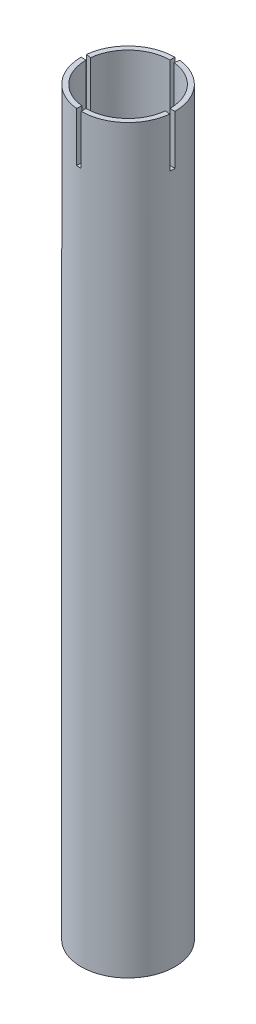
ISO-10303-21;
HEADER;
FILE_DESCRIPTION(('STEP AP214'),'2;1');
FILE_NAME('part.step','',(''),(''),'','','');
FILE_SCHEMA(('AUTOMOTIVE_DESIGN { 1 0 10303 214 1 1 1 1 }'));
ENDSEC;
DATA;
#1=APPLICATION_CONTEXT('core data for automotive mechanical design processes');
#2=APPLICATION_PROTOCOL_DEFINITION('international standard','automotive_design',2000,#1);
#3=PRODUCT_CONTEXT('',#1,'mechanical');
#4=PRODUCT('Part','Part','',(#3));
#5=PRODUCT_RELATED_PRODUCT_CATEGORY('part','',(#4));
#6=PRODUCT_DEFINITION_FORMATION('','',#4);
#7=PRODUCT_DEFINITION_CONTEXT('part definition',#1,'design');
#8=PRODUCT_DEFINITION('design','',#6,#7);
#9=PRODUCT_DEFINITION_SHAPE('','',#8);
#10=(LENGTH_UNIT() NAMED_UNIT(*) SI_UNIT(.MILLI.,.METRE.));
#11=(NAMED_UNIT(*) PLANE_ANGLE_UNIT() SI_UNIT($,.RADIAN.));
#12=(NAMED_UNIT(*) SI_UNIT($,.STERADIAN.) SOLID_ANGLE_UNIT());
#13=UNCERTAINTY_MEASURE_WITH_UNIT(LENGTH_MEASURE(1.E-05),#10,'distance_accuracy_value','');
#14=(GEOMETRIC_REPRESENTATION_CONTEXT(3) GLOBAL_UNCERTAINTY_ASSIGNED_CONTEXT((#13)) GLOBAL_UNIT_ASSIGNED_CONTEXT((#10,
#11,#12)) REPRESENTATION_CONTEXT('',''));
#15=CARTESIAN_POINT('',(0.,0.,0.));
#16=DIRECTION('',(0.,0.,1.));
#17=DIRECTION('',(1.,0.,0.));
#18=AXIS2_PLACEMENT_3D('',#15,#16,#17);
#19=CARTESIAN_POINT('',(0.,300.,0.));
#20=DIRECTION('',(0.,1.,0.));
#21=DIRECTION('',(0.,0.,1.));
#22=AXIS2_PLACEMENT_3D('',#19,#20,#21);
#23=PLANE('',#22);
#24=DIRECTION('',(0.994505452921407,0.,0.104684784518032));
#25=VECTOR('',#24,1.);
#26=CARTESIAN_POINT('',(19.,300.,1.9999999999998));
#27=LINE('',#26,#25);
#28=CARTESIAN_POINT('',(16.9065926996639,300.,1.77964133680655));
#29=VERTEX_POINT('',#28);
#30=CARTESIAN_POINT('',(18.8956036055067,300.,1.98901090584261));
#31=VERTEX_POINT('',#30);
#32=EDGE_CURVE('E282',#29,#31,#27,.T.);
#33=ORIENTED_EDGE('',*,*,#32,.F.);
#34=CARTESIAN_POINT('',(0.,300.,0.));
#35=DIRECTION('',(0.,1.,0.));
#36=DIRECTION('',(0.,0.,1.));
#37=AXIS2_PLACEMENT_3D('',#34,#35,#36);
#38=CIRCLE('',#37,17.);
#39=CARTESIAN_POINT('',(0.,300.,17.));
#40=VERTEX_POINT('',#39);
#41=EDGE_CURVE('E309',#40,#29,#38,.T.);
#42=ORIENTED_EDGE('',*,*,#41,.F.);
#43=DIRECTION('',(0.,0.,-1.));
#44=VECTOR('',#43,1.);
#45=CARTESIAN_POINT('',(0.,300.,0.));
#46=LINE('',#45,#44);
#47=CARTESIAN_POINT('',(0.,300.,19.));
#48=VERTEX_POINT('',#47);
#49=EDGE_CURVE('E189',#48,#40,#46,.T.);
#50=ORIENTED_EDGE('',*,*,#49,.F.);
#51=CARTESIAN_POINT('',(0.,300.,0.));
#52=DIRECTION('',(0.,1.,0.));
#53=DIRECTION('',(1.,0.,0.));
#54=AXIS2_PLACEMENT_3D('',#51,#52,#53);
#55=CIRCLE('',#54,19.);
#56=EDGE_CURVE('E288',#48,#31,#55,.T.);
#57=ORIENTED_EDGE('',*,*,#56,.T.);
#58=EDGE_LOOP('',(#33,#42,#50,#57));
#59=FACE_BOUND('',#58,.T.);
#60=ADVANCED_FACE('F48',(#59),#23,.T.);
#61=DIRECTION('',(-0.104684784518043,0.,0.994505452921406));
#62=VECTOR('',#61,1.);
#63=CARTESIAN_POINT('',(-2.,300.,19.));
#64=LINE('',#63,#62);
#65=CARTESIAN_POINT('',(-1.77964133680673,300.,16.9065926996639));
#66=VERTEX_POINT('',#65);
#67=CARTESIAN_POINT('',(-1.98901090584281,300.,18.8956036055067));
#68=VERTEX_POINT('',#67);
#69=EDGE_CURVE('E185',#66,#68,#64,.T.);
#70=ORIENTED_EDGE('',*,*,#69,.F.);
#71=CARTESIAN_POINT('',(-17.,300.,0.));
#72=VERTEX_POINT('',#71);
#73=EDGE_CURVE('E237',#72,#66,#38,.T.);
#74=ORIENTED_EDGE('',*,*,#73,.F.);
#75=DIRECTION('',(1.,0.,0.));
#76=VECTOR('',#75,1.);
#77=CARTESIAN_POINT('',(0.,300.,0.));
#78=LINE('',#77,#76);
#79=CARTESIAN_POINT('',(-19.,300.,0.));
#80=VERTEX_POINT('',#79);
#81=EDGE_CURVE('E205',#80,#72,#78,.T.);
#82=ORIENTED_EDGE('',*,*,#81,.F.);
#83=EDGE_CURVE('E245',#80,#68,#55,.T.);
#84=ORIENTED_EDGE('',*,*,#83,.T.);
#85=EDGE_LOOP('',(#70,#74,#82,#84));
#86=FACE_BOUND('',#85,.T.);
#87=ADVANCED_FACE('F318',(#86),#23,.T.);
#88=DIRECTION('',(-0.994505452921406,0.,-0.104684784518039));
#89=VECTOR('',#88,1.);
#90=CARTESIAN_POINT('',(-19.,300.,-1.99999999999993));
#91=LINE('',#90,#89);
#92=CARTESIAN_POINT('',(-16.9065926996639,300.,-1.77964133680667));
#93=VERTEX_POINT('',#92);
#94=CARTESIAN_POINT('',(-18.8956036055067,300.,-1.98901090584275));
#95=VERTEX_POINT('',#94);
#96=EDGE_CURVE('E200',#93,#95,#91,.T.);
#97=ORIENTED_EDGE('',*,*,#96,.F.);
#98=CARTESIAN_POINT('',(0.,300.,-17.));
#99=VERTEX_POINT('',#98);
#100=EDGE_CURVE('E233',#99,#93,#38,.T.);
#101=ORIENTED_EDGE('',*,*,#100,.F.);
#102=DIRECTION('',(0.,0.,1.));
#103=VECTOR('',#102,1.);
#104=CARTESIAN_POINT('',(0.,300.,0.));
#105=LINE('',#104,#103);
#106=CARTESIAN_POINT('',(0.,300.,-19.));
#107=VERTEX_POINT('',#106);
#108=EDGE_CURVE('E221',#107,#99,#105,.T.);
#109=ORIENTED_EDGE('',*,*,#108,.F.);
#110=EDGE_CURVE('E241',#107,#95,#55,.T.);
#111=ORIENTED_EDGE('',*,*,#110,.T.);
#112=EDGE_LOOP('',(#97,#101,#109,#111));
#113=FACE_BOUND('',#112,.T.);
#114=ADVANCED_FACE('F342',(#113),#23,.T.);
#115=DIRECTION('',(-1.,0.,0.));
#116=VECTOR('',#115,1.);
#117=CARTESIAN_POINT('',(0.,300.,0.));
#118=LINE('',#117,#116);
#119=CARTESIAN_POINT('',(19.,300.,-1.99014436314059E-13));
#120=VERTEX_POINT('',#119);
#121=CARTESIAN_POINT('',(17.,300.,-1.78065548281E-13));
#122=VERTEX_POINT('',#121);
#123=EDGE_CURVE('E181',#120,#122,#118,.T.);
#124=ORIENTED_EDGE('',*,*,#123,.F.);
#125=CARTESIAN_POINT('',(1.98901090584281,300.,-18.8956036055067));
#126=VERTEX_POINT('',#125);
#127=EDGE_CURVE('E178',#120,#126,#55,.T.);
#128=ORIENTED_EDGE('',*,*,#127,.T.);
#129=DIRECTION('',(0.104684784518043,0.,-0.994505452921406));
#130=VECTOR('',#129,1.);
#131=CARTESIAN_POINT('',(2.,300.,-19.));
#132=LINE('',#131,#130);
#133=CARTESIAN_POINT('',(1.77964133680673,300.,-16.9065926996639));
#134=VERTEX_POINT('',#133);
#135=EDGE_CURVE('E216',#134,#126,#132,.T.);
#136=ORIENTED_EDGE('',*,*,#135,.F.);
#137=EDGE_CURVE('E238',#122,#134,#38,.T.);
#138=ORIENTED_EDGE('',*,*,#137,.F.);
#139=EDGE_LOOP('',(#124,#128,#136,#138));
#140=FACE_BOUND('',#139,.T.);
#141=ADVANCED_FACE('F293',(#140),#23,.T.);
#142=CARTESIAN_POINT('',(0.,0.,0.));
#143=DIRECTION('',(0.,1.,0.));
#144=DIRECTION('',(0.,0.,1.));
#145=AXIS2_PLACEMENT_3D('',#142,#143,#144);
#146=PLANE('',#145);
#147=CARTESIAN_POINT('',(0.,0.,0.));
#148=DIRECTION('',(0.,1.,0.));
#149=DIRECTION('',(1.,0.,0.));
#150=AXIS2_PLACEMENT_3D('',#147,#148,#149);
#151=CIRCLE('',#150,19.);
#152=CARTESIAN_POINT('',(19.,0.,0.));
#153=VERTEX_POINT('',#152);
#154=EDGE_CURVE('E236',#153,#153,#151,.T.);
#155=ORIENTED_EDGE('',*,*,#154,.F.);
#156=EDGE_LOOP('',(#155));
#157=FACE_BOUND('',#156,.T.);
#158=CARTESIAN_POINT('',(0.,0.,0.));
#159=DIRECTION('',(0.,1.,0.));
#160=DIRECTION('',(0.,0.,1.));
#161=AXIS2_PLACEMENT_3D('',#158,#159,#160);
#162=CIRCLE('',#161,17.);
#163=CARTESIAN_POINT('',(0.,0.,17.));
#164=VERTEX_POINT('',#163);
#165=EDGE_CURVE('E232',#164,#164,#162,.T.);
#166=ORIENTED_EDGE('',*,*,#165,.T.);
#167=EDGE_LOOP('',(#166));
#168=FACE_BOUND('',#167,.T.);
#169=ADVANCED_FACE('F345',(#157,#168),#146,.F.);
#170=CARTESIAN_POINT('',(0.,300.,0.));
#171=DIRECTION('',(0.,-1.,0.));
#172=DIRECTION('',(0.,0.,-1.));
#173=AXIS2_PLACEMENT_3D('',#170,#171,#172);
#174=CYLINDRICAL_SURFACE('',#173,19.);
#175=CARTESIAN_POINT('',(0.,280.,0.));
#176=DIRECTION('',(0.,1.,0.));
#177=DIRECTION('',(0.,0.,1.));
#178=AXIS2_PLACEMENT_3D('',#175,#176,#177);
#179=CIRCLE('',#178,19.);
#180=CARTESIAN_POINT('',(18.8956036055067,280.,1.98901090584261));
#181=VERTEX_POINT('',#180);
#182=CARTESIAN_POINT('',(19.,280.,-1.99014436314059E-13));
#183=VERTEX_POINT('',#182);
#184=EDGE_CURVE('E159',#181,#183,#179,.T.);
#185=ORIENTED_EDGE('',*,*,#184,.F.);
#186=DIRECTION('',(0.,-1.,0.));
#187=VECTOR('',#186,1.);
#188=CARTESIAN_POINT('',(18.8956036055067,300.,1.98901090584261));
#189=LINE('',#188,#187);
#190=EDGE_CURVE('E166',#181,#31,#189,.F.);
#191=ORIENTED_EDGE('',*,*,#190,.T.);
#192=ORIENTED_EDGE('',*,*,#56,.F.);
#193=DIRECTION('',(0.,1.,0.));
#194=VECTOR('',#193,1.);
#195=CARTESIAN_POINT('',(0.,280.,19.));
#196=LINE('',#195,#194);
#197=CARTESIAN_POINT('',(0.,280.,19.));
#198=VERTEX_POINT('',#197);
#199=EDGE_CURVE('E191',#198,#48,#196,.T.);
#200=ORIENTED_EDGE('',*,*,#199,.F.);
#201=CARTESIAN_POINT('',(0.,280.,0.));
#202=DIRECTION('',(0.,1.,0.));
#203=DIRECTION('',(0.,0.,1.));
#204=AXIS2_PLACEMENT_3D('',#201,#202,#203);
#205=CIRCLE('',#204,19.);
#206=CARTESIAN_POINT('',(-1.98901090584281,280.,18.8956036055067));
#207=VERTEX_POINT('',#206);
#208=EDGE_CURVE('E195',#207,#198,#205,.T.);
#209=ORIENTED_EDGE('',*,*,#208,.F.);
#210=DIRECTION('',(0.,-1.,0.));
#211=VECTOR('',#210,1.);
#212=CARTESIAN_POINT('',(-1.98901090584281,300.,18.8956036055067));
#213=LINE('',#212,#211);
#214=EDGE_CURVE('E197',#207,#68,#213,.F.);
#215=ORIENTED_EDGE('',*,*,#214,.T.);
#216=ORIENTED_EDGE('',*,*,#83,.F.);
#217=DIRECTION('',(0.,1.,0.));
#218=VECTOR('',#217,1.);
#219=CARTESIAN_POINT('',(-19.,280.,0.));
#220=LINE('',#219,#218);
#221=CARTESIAN_POINT('',(-19.,280.,0.));
#222=VERTEX_POINT('',#221);
#223=EDGE_CURVE('E207',#222,#80,#220,.T.);
#224=ORIENTED_EDGE('',*,*,#223,.F.);
#225=CARTESIAN_POINT('',(0.,280.,0.));
#226=DIRECTION('',(0.,1.,0.));
#227=DIRECTION('',(0.,0.,1.));
#228=AXIS2_PLACEMENT_3D('',#225,#226,#227);
#229=CIRCLE('',#228,19.);
#230=CARTESIAN_POINT('',(-18.8956036055067,280.,-1.98901090584275));
#231=VERTEX_POINT('',#230);
#232=EDGE_CURVE('E211',#231,#222,#229,.T.);
#233=ORIENTED_EDGE('',*,*,#232,.F.);
#234=DIRECTION('',(0.,-1.,0.));
#235=VECTOR('',#234,1.);
#236=CARTESIAN_POINT('',(-18.8956036055067,300.,-1.98901090584275));
#237=LINE('',#236,#235);
#238=EDGE_CURVE('E213',#231,#95,#237,.F.);
#239=ORIENTED_EDGE('',*,*,#238,.T.);
#240=ORIENTED_EDGE('',*,*,#110,.F.);
#241=DIRECTION('',(0.,1.,0.));
#242=VECTOR('',#241,1.);
#243=CARTESIAN_POINT('',(0.,280.,-19.));
#244=LINE('',#243,#242);
#245=CARTESIAN_POINT('',(0.,280.,-19.));
#246=VERTEX_POINT('',#245);
#247=EDGE_CURVE('E223',#246,#107,#244,.T.);
#248=ORIENTED_EDGE('',*,*,#247,.F.);
#249=CARTESIAN_POINT('',(0.,280.,0.));
#250=DIRECTION('',(0.,1.,0.));
#251=DIRECTION('',(0.,0.,1.));
#252=AXIS2_PLACEMENT_3D('',#249,#250,#251);
#253=CIRCLE('',#252,19.);
#254=CARTESIAN_POINT('',(1.98901090584281,280.,-18.8956036055067));
#255=VERTEX_POINT('',#254);
#256=EDGE_CURVE('E228',#255,#246,#253,.T.);
#257=ORIENTED_EDGE('',*,*,#256,.F.);
#258=DIRECTION('',(0.,-1.,0.));
#259=VECTOR('',#258,1.);
#260=CARTESIAN_POINT('',(1.98901090584281,300.,-18.8956036055067));
#261=LINE('',#260,#259);
#262=EDGE_CURVE('E230',#255,#126,#261,.F.);
#263=ORIENTED_EDGE('',*,*,#262,.T.);
#264=ORIENTED_EDGE('',*,*,#127,.F.);
#265=DIRECTION('',(0.,1.,0.));
#266=VECTOR('',#265,1.);
#267=CARTESIAN_POINT('',(19.,280.,-1.99014436314059E-13));
#268=LINE('',#267,#266);
#269=EDGE_CURVE('E167',#183,#120,#268,.T.);
#270=ORIENTED_EDGE('',*,*,#269,.F.);
#271=EDGE_LOOP('',(#185,#191,#192,#200,#209,#215,#216,#224,#233,#239,#240,#248,#257,#263,#264,#270));
#272=FACE_BOUND('',#271,.T.);
#273=ORIENTED_EDGE('',*,*,#154,.T.);
#274=EDGE_LOOP('',(#273));
#275=FACE_BOUND('',#274,.T.);
#276=ADVANCED_FACE('F50',(#272,#275),#174,.T.);
#277=CARTESIAN_POINT('',(0.,300.,0.));
#278=DIRECTION('',(0.,-1.,0.));
#279=DIRECTION('',(0.,0.,-1.));
#280=AXIS2_PLACEMENT_3D('',#277,#278,#279);
#281=CYLINDRICAL_SURFACE('',#280,17.);
#282=DIRECTION('',(0.,-1.,0.));
#283=VECTOR('',#282,1.);
#284=CARTESIAN_POINT('',(16.9065926996639,300.,1.77964133680655));
#285=LINE('',#284,#283);
#286=CARTESIAN_POINT('',(16.9065926996639,280.,1.77964133680655));
#287=VERTEX_POINT('',#286);
#288=EDGE_CURVE('E12',#287,#29,#285,.F.);
#289=ORIENTED_EDGE('',*,*,#288,.F.);
#290=CARTESIAN_POINT('',(0.,280.,0.));
#291=DIRECTION('',(0.,1.,0.));
#292=DIRECTION('',(0.,0.,1.));
#293=AXIS2_PLACEMENT_3D('',#290,#291,#292);
#294=CIRCLE('',#293,17.);
#295=CARTESIAN_POINT('',(17.,280.,-1.78065548281E-13));
#296=VERTEX_POINT('',#295);
#297=EDGE_CURVE('E271',#287,#296,#294,.T.);
#298=ORIENTED_EDGE('',*,*,#297,.T.);
#299=DIRECTION('',(0.,-1.,0.));
#300=VECTOR('',#299,1.);
#301=CARTESIAN_POINT('',(17.,300.,-1.78065548281E-13));
#302=LINE('',#301,#300);
#303=EDGE_CURVE('E56',#122,#296,#302,.T.);
#304=ORIENTED_EDGE('',*,*,#303,.F.);
#305=ORIENTED_EDGE('',*,*,#137,.T.);
#306=DIRECTION('',(0.,-1.,0.));
#307=VECTOR('',#306,1.);
#308=CARTESIAN_POINT('',(1.77964133680673,300.,-16.9065926996639));
#309=LINE('',#308,#307);
#310=CARTESIAN_POINT('',(1.77964133680673,280.,-16.9065926996639));
#311=VERTEX_POINT('',#310);
#312=EDGE_CURVE('E253',#311,#134,#309,.F.);
#313=ORIENTED_EDGE('',*,*,#312,.F.);
#314=CARTESIAN_POINT('',(0.,280.,0.));
#315=DIRECTION('',(0.,1.,0.));
#316=DIRECTION('',(0.,0.,1.));
#317=AXIS2_PLACEMENT_3D('',#314,#315,#316);
#318=CIRCLE('',#317,17.);
#319=CARTESIAN_POINT('',(0.,280.,-17.));
#320=VERTEX_POINT('',#319);
#321=EDGE_CURVE('E244',#311,#320,#318,.T.);
#322=ORIENTED_EDGE('',*,*,#321,.T.);
#323=DIRECTION('',(0.,-1.,0.));
#324=VECTOR('',#323,1.);
#325=CARTESIAN_POINT('',(0.,300.,-17.));
#326=LINE('',#325,#324);
#327=EDGE_CURVE('E250',#99,#320,#326,.T.);
#328=ORIENTED_EDGE('',*,*,#327,.F.);
#329=ORIENTED_EDGE('',*,*,#100,.T.);
#330=DIRECTION('',(0.,-1.,0.));
#331=VECTOR('',#330,1.);
#332=CARTESIAN_POINT('',(-16.9065926996639,300.,-1.77964133680667));
#333=LINE('',#332,#331);
#334=CARTESIAN_POINT('',(-16.9065926996639,280.,-1.77964133680667));
#335=VERTEX_POINT('',#334);
#336=EDGE_CURVE('E262',#335,#93,#333,.F.);
#337=ORIENTED_EDGE('',*,*,#336,.F.);
#338=CARTESIAN_POINT('',(0.,280.,0.));
#339=DIRECTION('',(0.,1.,0.));
#340=DIRECTION('',(0.,0.,1.));
#341=AXIS2_PLACEMENT_3D('',#338,#339,#340);
#342=CIRCLE('',#341,17.);
#343=CARTESIAN_POINT('',(-17.,280.,0.));
#344=VERTEX_POINT('',#343);
#345=EDGE_CURVE('E256',#335,#344,#342,.T.);
#346=ORIENTED_EDGE('',*,*,#345,.T.);
#347=DIRECTION('',(0.,-1.,0.));
#348=VECTOR('',#347,1.);
#349=CARTESIAN_POINT('',(-17.,300.,0.));
#350=LINE('',#349,#348);
#351=EDGE_CURVE('E259',#72,#344,#350,.T.);
#352=ORIENTED_EDGE('',*,*,#351,.F.);
#353=ORIENTED_EDGE('',*,*,#73,.T.);
#354=DIRECTION('',(0.,-1.,0.));
#355=VECTOR('',#354,1.);
#356=CARTESIAN_POINT('',(-1.77964133680673,300.,16.9065926996639));
#357=LINE('',#356,#355);
#358=CARTESIAN_POINT('',(-1.77964133680673,280.,16.9065926996639));
#359=VERTEX_POINT('',#358);
#360=EDGE_CURVE('E269',#359,#66,#357,.F.);
#361=ORIENTED_EDGE('',*,*,#360,.F.);
#362=CARTESIAN_POINT('',(0.,280.,0.));
#363=DIRECTION('',(0.,1.,0.));
#364=DIRECTION('',(0.,0.,1.));
#365=AXIS2_PLACEMENT_3D('',#362,#363,#364);
#366=CIRCLE('',#365,17.);
#367=CARTESIAN_POINT('',(0.,280.,17.));
#368=VERTEX_POINT('',#367);
#369=EDGE_CURVE('E264',#359,#368,#366,.T.);
#370=ORIENTED_EDGE('',*,*,#369,.T.);
#371=DIRECTION('',(0.,-1.,0.));
#372=VECTOR('',#371,1.);
#373=CARTESIAN_POINT('',(0.,300.,17.));
#374=LINE('',#373,#372);
#375=EDGE_CURVE('E267',#40,#368,#374,.T.);
#376=ORIENTED_EDGE('',*,*,#375,.F.);
#377=ORIENTED_EDGE('',*,*,#41,.T.);
#378=EDGE_LOOP('',(#289,#298,#304,#305,#313,#322,#328,#329,#337,#346,#352,#353,#361,#370,#376,#377));
#379=FACE_BOUND('',#378,.T.);
#380=ORIENTED_EDGE('',*,*,#165,.F.);
#381=EDGE_LOOP('',(#380));
#382=FACE_BOUND('',#381,.T.);
#383=ADVANCED_FACE('F274',(#379,#382),#281,.F.);
#384=CARTESIAN_POINT('',(2.,280.,-19.));
#385=DIRECTION('',(0.994505452921406,0.,0.104684784518043));
#386=DIRECTION('',(0.104684784518043,0.,-0.994505452921406));
#387=AXIS2_PLACEMENT_3D('',#384,#385,#386);
#388=PLANE('',#387);
#389=DIRECTION('',(0.104684784518043,0.,-0.994505452921406));
#390=VECTOR('',#389,1.);
#391=CARTESIAN_POINT('',(2.,280.,-19.));
#392=LINE('',#391,#390);
#393=EDGE_CURVE('E217',#311,#255,#392,.T.);
#394=ORIENTED_EDGE('',*,*,#393,.F.);
#395=ORIENTED_EDGE('',*,*,#312,.T.);
#396=ORIENTED_EDGE('',*,*,#135,.T.);
#397=ORIENTED_EDGE('',*,*,#262,.F.);
#398=EDGE_LOOP('',(#394,#395,#396,#397));
#399=FACE_BOUND('',#398,.T.);
#400=ADVANCED_FACE('F296',(#399),#388,.F.);
#401=CARTESIAN_POINT('',(0.,280.,0.));
#402=DIRECTION('',(0.,1.,0.));
#403=DIRECTION('',(0.,0.,1.));
#404=AXIS2_PLACEMENT_3D('',#401,#402,#403);
#405=PLANE('',#404);
#406=ORIENTED_EDGE('',*,*,#256,.T.);
#407=DIRECTION('',(0.,0.,1.));
#408=VECTOR('',#407,1.);
#409=CARTESIAN_POINT('',(0.,280.,0.));
#410=LINE('',#409,#408);
#411=EDGE_CURVE('E220',#246,#320,#410,.T.);
#412=ORIENTED_EDGE('',*,*,#411,.T.);
#413=ORIENTED_EDGE('',*,*,#321,.F.);
#414=ORIENTED_EDGE('',*,*,#393,.T.);
#415=EDGE_LOOP('',(#406,#412,#413,#414));
#416=FACE_BOUND('',#415,.T.);
#417=ADVANCED_FACE('F303',(#416),#405,.T.);
#418=CARTESIAN_POINT('',(0.,280.,0.));
#419=DIRECTION('',(-1.,0.,0.));
#420=DIRECTION('',(0.,0.,1.));
#421=AXIS2_PLACEMENT_3D('',#418,#419,#420);
#422=PLANE('',#421);
#423=ORIENTED_EDGE('',*,*,#327,.T.);
#424=ORIENTED_EDGE('',*,*,#411,.F.);
#425=ORIENTED_EDGE('',*,*,#247,.T.);
#426=ORIENTED_EDGE('',*,*,#108,.T.);
#427=EDGE_LOOP('',(#423,#424,#425,#426));
#428=FACE_BOUND('',#427,.T.);
#429=ADVANCED_FACE('F305',(#428),#422,.F.);
#430=CARTESIAN_POINT('',(-19.,280.,-1.99999999999993));
#431=DIRECTION('',(0.104684784518039,0.,-0.994505452921406));
#432=DIRECTION('',(-0.994505452921406,0.,-0.104684784518039));
#433=AXIS2_PLACEMENT_3D('',#430,#431,#432);
#434=PLANE('',#433);
#435=DIRECTION('',(-0.994505452921406,0.,-0.104684784518039));
#436=VECTOR('',#435,1.);
#437=CARTESIAN_POINT('',(-19.,280.,-1.99999999999993));
#438=LINE('',#437,#436);
#439=EDGE_CURVE('E201',#335,#231,#438,.T.);
#440=ORIENTED_EDGE('',*,*,#439,.F.);
#441=ORIENTED_EDGE('',*,*,#336,.T.);
#442=ORIENTED_EDGE('',*,*,#96,.T.);
#443=ORIENTED_EDGE('',*,*,#238,.F.);
#444=EDGE_LOOP('',(#440,#441,#442,#443));
#445=FACE_BOUND('',#444,.T.);
#446=ADVANCED_FACE('F358',(#445),#434,.F.);
#447=CARTESIAN_POINT('',(0.,280.,0.));
#448=DIRECTION('',(0.,1.,0.));
#449=DIRECTION('',(1.,0.,0.));
#450=AXIS2_PLACEMENT_3D('',#447,#448,#449);
#451=PLANE('',#450);
#452=ORIENTED_EDGE('',*,*,#232,.T.);
#453=DIRECTION('',(1.,0.,0.));
#454=VECTOR('',#453,1.);
#455=CARTESIAN_POINT('',(0.,280.,0.));
#456=LINE('',#455,#454);
#457=EDGE_CURVE('E204',#222,#344,#456,.T.);
#458=ORIENTED_EDGE('',*,*,#457,.T.);
#459=ORIENTED_EDGE('',*,*,#345,.F.);
#460=ORIENTED_EDGE('',*,*,#439,.T.);
#461=EDGE_LOOP('',(#452,#458,#459,#460));
#462=FACE_BOUND('',#461,.T.);
#463=ADVANCED_FACE('F361',(#462),#451,.T.);
#464=CARTESIAN_POINT('',(0.,280.,0.));
#465=DIRECTION('',(0.,0.,1.));
#466=DIRECTION('',(1.,0.,0.));
#467=AXIS2_PLACEMENT_3D('',#464,#465,#466);
#468=PLANE('',#467);
#469=ORIENTED_EDGE('',*,*,#351,.T.);
#470=ORIENTED_EDGE('',*,*,#457,.F.);
#471=ORIENTED_EDGE('',*,*,#223,.T.);
#472=ORIENTED_EDGE('',*,*,#81,.T.);
#473=EDGE_LOOP('',(#469,#470,#471,#472));
#474=FACE_BOUND('',#473,.T.);
#475=ADVANCED_FACE('F364',(#474),#468,.F.);
#476=CARTESIAN_POINT('',(-2.,280.,19.));
#477=DIRECTION('',(-0.994505452921406,0.,-0.104684784518043));
#478=DIRECTION('',(-0.104684784518043,0.,0.994505452921406));
#479=AXIS2_PLACEMENT_3D('',#476,#477,#478);
#480=PLANE('',#479);
#481=DIRECTION('',(-0.104684784518043,0.,0.994505452921406));
#482=VECTOR('',#481,1.);
#483=CARTESIAN_POINT('',(-2.,280.,19.));
#484=LINE('',#483,#482);
#485=EDGE_CURVE('E186',#359,#207,#484,.T.);
#486=ORIENTED_EDGE('',*,*,#485,.F.);
#487=ORIENTED_EDGE('',*,*,#360,.T.);
#488=ORIENTED_EDGE('',*,*,#69,.T.);
#489=ORIENTED_EDGE('',*,*,#214,.F.);
#490=EDGE_LOOP('',(#486,#487,#488,#489));
#491=FACE_BOUND('',#490,.T.);
#492=ADVANCED_FACE('F322',(#491),#480,.F.);
#493=CARTESIAN_POINT('',(0.,280.,0.));
#494=DIRECTION('',(0.,1.,0.));
#495=DIRECTION('',(0.,0.,-1.));
#496=AXIS2_PLACEMENT_3D('',#493,#494,#495);
#497=PLANE('',#496);
#498=ORIENTED_EDGE('',*,*,#208,.T.);
#499=DIRECTION('',(0.,0.,-1.));
#500=VECTOR('',#499,1.);
#501=CARTESIAN_POINT('',(0.,280.,0.));
#502=LINE('',#501,#500);
#503=EDGE_CURVE('E71',#198,#368,#502,.T.);
#504=ORIENTED_EDGE('',*,*,#503,.T.);
#505=ORIENTED_EDGE('',*,*,#369,.F.);
#506=ORIENTED_EDGE('',*,*,#485,.T.);
#507=EDGE_LOOP('',(#498,#504,#505,#506));
#508=FACE_BOUND('',#507,.T.);
#509=ADVANCED_FACE('F325',(#508),#497,.T.);
#510=CARTESIAN_POINT('',(0.,280.,0.));
#511=DIRECTION('',(1.,0.,0.));
#512=DIRECTION('',(0.,0.,-1.));
#513=AXIS2_PLACEMENT_3D('',#510,#511,#512);
#514=PLANE('',#513);
#515=ORIENTED_EDGE('',*,*,#375,.T.);
#516=ORIENTED_EDGE('',*,*,#503,.F.);
#517=ORIENTED_EDGE('',*,*,#199,.T.);
#518=ORIENTED_EDGE('',*,*,#49,.T.);
#519=EDGE_LOOP('',(#515,#516,#517,#518));
#520=FACE_BOUND('',#519,.T.);
#521=ADVANCED_FACE('F327',(#520),#514,.F.);
#522=CARTESIAN_POINT('',(19.,280.,1.9999999999998));
#523=DIRECTION('',(-0.104684784518032,0.,0.994505452921407));
#524=DIRECTION('',(0.994505452921407,0.,0.104684784518032));
#525=AXIS2_PLACEMENT_3D('',#522,#523,#524);
#526=PLANE('',#525);
#527=DIRECTION('',(0.994505452921407,0.,0.104684784518032));
#528=VECTOR('',#527,1.);
#529=CARTESIAN_POINT('',(19.,280.,1.9999999999998));
#530=LINE('',#529,#528);
#531=EDGE_CURVE('E162',#287,#181,#530,.T.);
#532=ORIENTED_EDGE('',*,*,#531,.F.);
#533=ORIENTED_EDGE('',*,*,#288,.T.);
#534=ORIENTED_EDGE('',*,*,#32,.T.);
#535=ORIENTED_EDGE('',*,*,#190,.F.);
#536=EDGE_LOOP('',(#532,#533,#534,#535));
#537=FACE_BOUND('',#536,.T.);
#538=ADVANCED_FACE('F279',(#537),#526,.F.);
#539=CARTESIAN_POINT('',(0.,280.,0.));
#540=DIRECTION('',(0.,1.,0.));
#541=DIRECTION('',(-1.,0.,0.));
#542=AXIS2_PLACEMENT_3D('',#539,#540,#541);
#543=PLANE('',#542);
#544=ORIENTED_EDGE('',*,*,#184,.T.);
#545=DIRECTION('',(-1.,0.,0.));
#546=VECTOR('',#545,1.);
#547=CARTESIAN_POINT('',(0.,280.,0.));
#548=LINE('',#547,#546);
#549=EDGE_CURVE('E63',#183,#296,#548,.T.);
#550=ORIENTED_EDGE('',*,*,#549,.T.);
#551=ORIENTED_EDGE('',*,*,#297,.F.);
#552=ORIENTED_EDGE('',*,*,#531,.T.);
#553=EDGE_LOOP('',(#544,#550,#551,#552));
#554=FACE_BOUND('',#553,.T.);
#555=ADVANCED_FACE('F160',(#554),#543,.T.);
#556=CARTESIAN_POINT('',(0.,280.,0.));
#557=DIRECTION('',(0.,0.,-1.));
#558=DIRECTION('',(-1.,0.,0.));
#559=AXIS2_PLACEMENT_3D('',#556,#557,#558);
#560=PLANE('',#559);
#561=ORIENTED_EDGE('',*,*,#303,.T.);
#562=ORIENTED_EDGE('',*,*,#549,.F.);
#563=ORIENTED_EDGE('',*,*,#269,.T.);
#564=ORIENTED_EDGE('',*,*,#123,.T.);
#565=EDGE_LOOP('',(#561,#562,#563,#564));
#566=FACE_BOUND('',#565,.T.);
#567=ADVANCED_FACE('F170',(#566),#560,.F.);
#568=CLOSED_SHELL('',(#60,#87,#114,#141,#169,#276,#383,#400,#417,#429,#446,#463,#475,#492,#509,
#521,#538,#555,#567));
#569=MANIFOLD_SOLID_BREP('B2',#568);
#570=ADVANCED_BREP_SHAPE_REPRESENTATION('',(#18,#569),#14);
#571=SHAPE_DEFINITION_REPRESENTATION(#9,#570);
ENDSEC;
END-ISO-10303-21;
